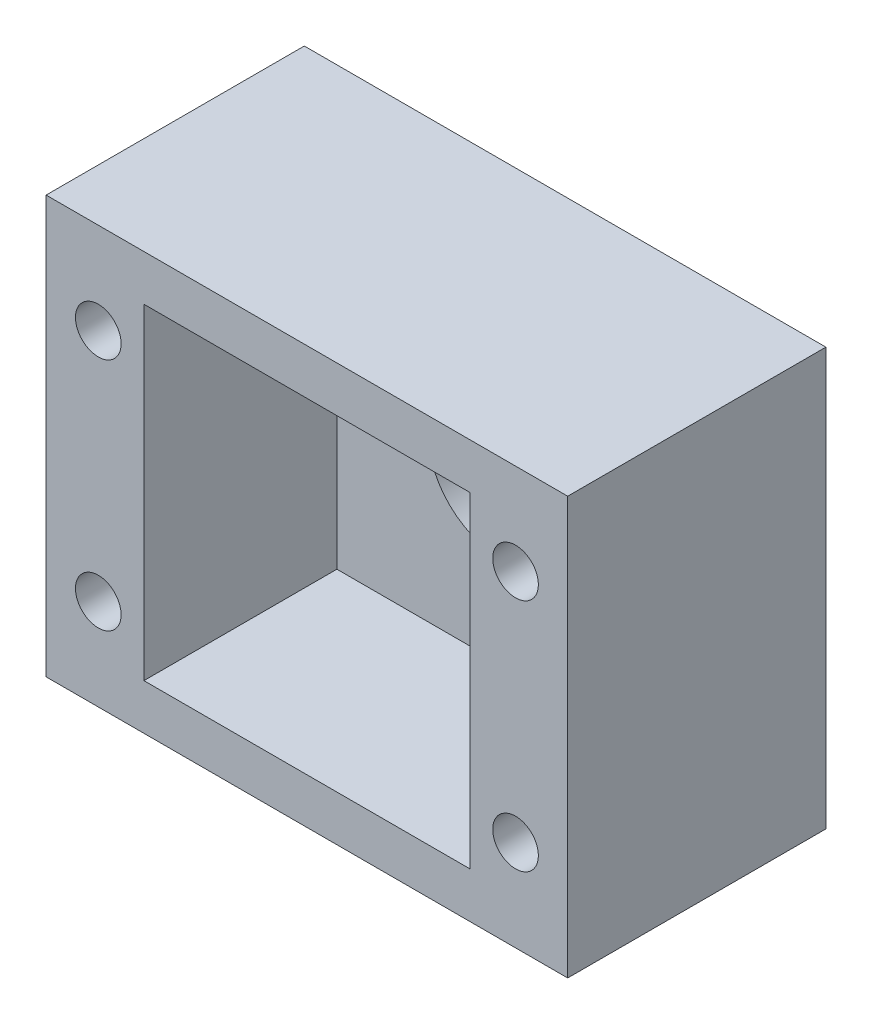
ISO-10303-21;
HEADER;
FILE_DESCRIPTION(('STEP AP214'),'2;1');
FILE_NAME('part.step','',(''),(''),'','','');
FILE_SCHEMA(('AUTOMOTIVE_DESIGN { 1 0 10303 214 1 1 1 1 }'));
ENDSEC;
DATA;
#1=APPLICATION_CONTEXT('core data for automotive mechanical design processes');
#2=APPLICATION_PROTOCOL_DEFINITION('international standard','automotive_design',2000,#1);
#3=PRODUCT_CONTEXT('',#1,'mechanical');
#4=PRODUCT('Part','Part','',(#3));
#5=PRODUCT_RELATED_PRODUCT_CATEGORY('part','',(#4));
#6=PRODUCT_DEFINITION_FORMATION('','',#4);
#7=PRODUCT_DEFINITION_CONTEXT('part definition',#1,'design');
#8=PRODUCT_DEFINITION('design','',#6,#7);
#9=PRODUCT_DEFINITION_SHAPE('','',#8);
#10=(LENGTH_UNIT() NAMED_UNIT(*) SI_UNIT(.MILLI.,.METRE.));
#11=(NAMED_UNIT(*) PLANE_ANGLE_UNIT() SI_UNIT($,.RADIAN.));
#12=(NAMED_UNIT(*) SI_UNIT($,.STERADIAN.) SOLID_ANGLE_UNIT());
#13=UNCERTAINTY_MEASURE_WITH_UNIT(LENGTH_MEASURE(1.E-05),#10,'distance_accuracy_value','');
#14=(GEOMETRIC_REPRESENTATION_CONTEXT(3) GLOBAL_UNCERTAINTY_ASSIGNED_CONTEXT((#13)) GLOBAL_UNIT_ASSIGNED_CONTEXT((#10,
#11,#12)) REPRESENTATION_CONTEXT('',''));
#15=CARTESIAN_POINT('',(0.,0.,0.));
#16=DIRECTION('',(0.,0.,1.));
#17=DIRECTION('',(1.,0.,0.));
#18=AXIS2_PLACEMENT_3D('',#15,#16,#17);
#19=CARTESIAN_POINT('',(-12.5,-12.5,5.));
#20=DIRECTION('',(0.,0.,1.));
#21=DIRECTION('',(1.,0.,0.));
#22=AXIS2_PLACEMENT_3D('',#19,#20,#21);
#23=PLANE('',#22);
#24=CARTESIAN_POINT('',(8.,0.,5.));
#25=DIRECTION('',(0.,0.,1.));
#26=DIRECTION('',(1.,0.,0.));
#27=AXIS2_PLACEMENT_3D('',#24,#25,#26);
#28=CIRCLE('',#27,1.25);
#29=CARTESIAN_POINT('',(9.25,0.,5.));
#30=VERTEX_POINT('',#29);
#31=EDGE_CURVE('E10',#30,#30,#28,.T.);
#32=ORIENTED_EDGE('',*,*,#31,.F.);
#33=EDGE_LOOP('',(#32));
#34=FACE_BOUND('',#33,.T.);
#35=CARTESIAN_POINT('',(0.,0.,5.));
#36=DIRECTION('',(0.,0.,1.));
#37=DIRECTION('',(1.,0.,0.));
#38=AXIS2_PLACEMENT_3D('',#35,#36,#37);
#39=CIRCLE('',#38,5.5);
#40=CARTESIAN_POINT('',(5.5,0.,5.));
#41=VERTEX_POINT('',#40);
#42=EDGE_CURVE('E24',#41,#41,#39,.T.);
#43=ORIENTED_EDGE('',*,*,#42,.F.);
#44=EDGE_LOOP('',(#43));
#45=FACE_BOUND('',#44,.T.);
#46=CARTESIAN_POINT('',(-8.,0.,5.));
#47=DIRECTION('',(0.,0.,1.));
#48=DIRECTION('',(1.,0.,0.));
#49=AXIS2_PLACEMENT_3D('',#46,#47,#48);
#50=CIRCLE('',#49,1.25);
#51=CARTESIAN_POINT('',(-6.75,0.,5.));
#52=VERTEX_POINT('',#51);
#53=EDGE_CURVE('E123',#52,#52,#50,.T.);
#54=ORIENTED_EDGE('',*,*,#53,.F.);
#55=EDGE_LOOP('',(#54));
#56=FACE_BOUND('',#55,.T.);
#57=DIRECTION('',(0.,1.,0.));
#58=VECTOR('',#57,1.);
#59=CARTESIAN_POINT('',(-12.5,-12.5,5.));
#60=LINE('',#59,#58);
#61=CARTESIAN_POINT('',(-12.5,-12.5,5.));
#62=VERTEX_POINT('',#61);
#63=CARTESIAN_POINT('',(-12.5,12.5,5.));
#64=VERTEX_POINT('',#63);
#65=EDGE_CURVE('E86',#62,#64,#60,.T.);
#66=ORIENTED_EDGE('',*,*,#65,.F.);
#67=DIRECTION('',(1.,0.,0.));
#68=VECTOR('',#67,1.);
#69=CARTESIAN_POINT('',(-12.5,-12.5,5.));
#70=LINE('',#69,#68);
#71=CARTESIAN_POINT('',(12.5,-12.5,5.));
#72=VERTEX_POINT('',#71);
#73=EDGE_CURVE('E89',#62,#72,#70,.T.);
#74=ORIENTED_EDGE('',*,*,#73,.T.);
#75=DIRECTION('',(0.,1.,0.));
#76=VECTOR('',#75,1.);
#77=CARTESIAN_POINT('',(12.5,-12.5,5.));
#78=LINE('',#77,#76);
#79=CARTESIAN_POINT('',(12.5,12.5,5.));
#80=VERTEX_POINT('',#79);
#81=EDGE_CURVE('E77',#72,#80,#78,.T.);
#82=ORIENTED_EDGE('',*,*,#81,.T.);
#83=DIRECTION('',(1.,0.,0.));
#84=VECTOR('',#83,1.);
#85=CARTESIAN_POINT('',(-12.5,12.5,5.));
#86=LINE('',#85,#84);
#87=EDGE_CURVE('E36',#64,#80,#86,.T.);
#88=ORIENTED_EDGE('',*,*,#87,.F.);
#89=EDGE_LOOP('',(#66,#74,#82,#88));
#90=FACE_BOUND('',#89,.T.);
#91=ADVANCED_FACE('F16',(#34,#45,#56,#90),#23,.T.);
#92=CARTESIAN_POINT('',(8.,0.,-1.));
#93=DIRECTION('',(0.,0.,1.));
#94=DIRECTION('',(1.,0.,0.));
#95=AXIS2_PLACEMENT_3D('',#92,#93,#94);
#96=CYLINDRICAL_SURFACE('',#95,1.25);
#97=ORIENTED_EDGE('',*,*,#31,.T.);
#98=EDGE_LOOP('',(#97));
#99=FACE_BOUND('',#98,.T.);
#100=CARTESIAN_POINT('',(8.,0.,0.));
#101=DIRECTION('',(0.,0.,1.));
#102=DIRECTION('',(1.,0.,0.));
#103=AXIS2_PLACEMENT_3D('',#100,#101,#102);
#104=CIRCLE('',#103,1.25);
#105=CARTESIAN_POINT('',(9.25,0.,0.));
#106=VERTEX_POINT('',#105);
#107=EDGE_CURVE('E108',#106,#106,#104,.T.);
#108=ORIENTED_EDGE('',*,*,#107,.F.);
#109=EDGE_LOOP('',(#108));
#110=FACE_BOUND('',#109,.T.);
#111=ADVANCED_FACE('F197',(#99,#110),#96,.F.);
#112=CARTESIAN_POINT('',(0.,0.,-1.));
#113=DIRECTION('',(0.,0.,1.));
#114=DIRECTION('',(1.,0.,0.));
#115=AXIS2_PLACEMENT_3D('',#112,#113,#114);
#116=CYLINDRICAL_SURFACE('',#115,5.5);
#117=ORIENTED_EDGE('',*,*,#42,.T.);
#118=EDGE_LOOP('',(#117));
#119=FACE_BOUND('',#118,.T.);
#120=CARTESIAN_POINT('',(0.,0.,0.));
#121=DIRECTION('',(0.,0.,1.));
#122=DIRECTION('',(1.,0.,0.));
#123=AXIS2_PLACEMENT_3D('',#120,#121,#122);
#124=CIRCLE('',#123,5.5);
#125=CARTESIAN_POINT('',(5.5,0.,0.));
#126=VERTEX_POINT('',#125);
#127=EDGE_CURVE('E135',#126,#126,#124,.T.);
#128=ORIENTED_EDGE('',*,*,#127,.F.);
#129=EDGE_LOOP('',(#128));
#130=FACE_BOUND('',#129,.T.);
#131=ADVANCED_FACE('F186',(#119,#130),#116,.F.);
#132=CARTESIAN_POINT('',(-8.,0.,-1.));
#133=DIRECTION('',(0.,0.,1.));
#134=DIRECTION('',(1.,0.,0.));
#135=AXIS2_PLACEMENT_3D('',#132,#133,#134);
#136=CYLINDRICAL_SURFACE('',#135,1.25);
#137=ORIENTED_EDGE('',*,*,#53,.T.);
#138=EDGE_LOOP('',(#137));
#139=FACE_BOUND('',#138,.T.);
#140=CARTESIAN_POINT('',(-8.,0.,0.));
#141=DIRECTION('',(0.,0.,1.));
#142=DIRECTION('',(1.,0.,0.));
#143=AXIS2_PLACEMENT_3D('',#140,#141,#142);
#144=CIRCLE('',#143,1.25);
#145=CARTESIAN_POINT('',(-6.75,0.,0.));
#146=VERTEX_POINT('',#145);
#147=EDGE_CURVE('E148',#146,#146,#144,.T.);
#148=ORIENTED_EDGE('',*,*,#147,.F.);
#149=EDGE_LOOP('',(#148));
#150=FACE_BOUND('',#149,.T.);
#151=ADVANCED_FACE('F183',(#139,#150),#136,.F.);
#152=CARTESIAN_POINT('',(16.,9.,-1.));
#153=DIRECTION('',(0.,0.,1.));
#154=DIRECTION('',(1.,0.,0.));
#155=AXIS2_PLACEMENT_3D('',#152,#153,#154);
#156=CYLINDRICAL_SURFACE('',#155,1.75);
#157=CARTESIAN_POINT('',(16.,9.,19.8));
#158=DIRECTION('',(0.,0.,1.));
#159=DIRECTION('',(1.,0.,0.));
#160=AXIS2_PLACEMENT_3D('',#157,#158,#159);
#161=CIRCLE('',#160,1.75);
#162=CARTESIAN_POINT('',(17.75,9.,19.8));
#163=VERTEX_POINT('',#162);
#164=EDGE_CURVE('E155',#163,#163,#161,.T.);
#165=ORIENTED_EDGE('',*,*,#164,.T.);
#166=EDGE_LOOP('',(#165));
#167=FACE_BOUND('',#166,.T.);
#168=CARTESIAN_POINT('',(16.,9.,0.));
#169=DIRECTION('',(0.,0.,1.));
#170=DIRECTION('',(1.,0.,0.));
#171=AXIS2_PLACEMENT_3D('',#168,#169,#170);
#172=CIRCLE('',#171,1.75);
#173=CARTESIAN_POINT('',(17.75,9.,0.));
#174=VERTEX_POINT('',#173);
#175=EDGE_CURVE('E102',#174,#174,#172,.T.);
#176=ORIENTED_EDGE('',*,*,#175,.F.);
#177=EDGE_LOOP('',(#176));
#178=FACE_BOUND('',#177,.T.);
#179=ADVANCED_FACE('F185',(#167,#178),#156,.F.);
#180=CARTESIAN_POINT('',(-12.5,12.5,5.));
#181=DIRECTION('',(0.,1.,0.));
#182=DIRECTION('',(1.,0.,0.));
#183=AXIS2_PLACEMENT_3D('',#180,#181,#182);
#184=PLANE('',#183);
#185=DIRECTION('',(-1.,0.,0.));
#186=VECTOR('',#185,1.);
#187=CARTESIAN_POINT('',(-16.25,12.5,19.8));
#188=LINE('',#187,#186);
#189=CARTESIAN_POINT('',(12.5,12.5,19.8));
#190=VERTEX_POINT('',#189);
#191=CARTESIAN_POINT('',(-12.5,12.5,19.8));
#192=VERTEX_POINT('',#191);
#193=EDGE_CURVE('E156',#190,#192,#188,.T.);
#194=ORIENTED_EDGE('',*,*,#193,.T.);
#195=DIRECTION('',(0.,0.,1.));
#196=VECTOR('',#195,1.);
#197=CARTESIAN_POINT('',(-12.5,12.5,5.));
#198=LINE('',#197,#196);
#199=EDGE_CURVE('E116',#64,#192,#198,.T.);
#200=ORIENTED_EDGE('',*,*,#199,.F.);
#201=ORIENTED_EDGE('',*,*,#87,.T.);
#202=DIRECTION('',(0.,0.,1.));
#203=VECTOR('',#202,1.);
#204=CARTESIAN_POINT('',(12.5,12.5,5.));
#205=LINE('',#204,#203);
#206=EDGE_CURVE('E84',#80,#190,#205,.T.);
#207=ORIENTED_EDGE('',*,*,#206,.T.);
#208=EDGE_LOOP('',(#194,#200,#201,#207));
#209=FACE_BOUND('',#208,.T.);
#210=ADVANCED_FACE('F194',(#209),#184,.F.);
#211=CARTESIAN_POINT('',(-12.5,-12.5,5.));
#212=DIRECTION('',(1.,0.,0.));
#213=DIRECTION('',(0.,1.,0.));
#214=AXIS2_PLACEMENT_3D('',#211,#212,#213);
#215=PLANE('',#214);
#216=DIRECTION('',(0.,0.,1.));
#217=VECTOR('',#216,1.);
#218=CARTESIAN_POINT('',(-12.5,-12.5,5.));
#219=LINE('',#218,#217);
#220=CARTESIAN_POINT('',(-12.5,-12.5,19.8));
#221=VERTEX_POINT('',#220);
#222=EDGE_CURVE('E95',#62,#221,#219,.T.);
#223=ORIENTED_EDGE('',*,*,#222,.F.);
#224=ORIENTED_EDGE('',*,*,#65,.T.);
#225=ORIENTED_EDGE('',*,*,#199,.T.);
#226=DIRECTION('',(0.,1.,0.));
#227=VECTOR('',#226,1.);
#228=CARTESIAN_POINT('',(-12.5,-14.25,19.8));
#229=LINE('',#228,#227);
#230=EDGE_CURVE('E151',#221,#192,#229,.T.);
#231=ORIENTED_EDGE('',*,*,#230,.F.);
#232=EDGE_LOOP('',(#223,#224,#225,#231));
#233=FACE_BOUND('',#232,.T.);
#234=ADVANCED_FACE('F433',(#233),#215,.T.);
#235=CARTESIAN_POINT('',(12.5,-12.5,5.));
#236=DIRECTION('',(1.,0.,0.));
#237=DIRECTION('',(0.,1.,0.));
#238=AXIS2_PLACEMENT_3D('',#235,#236,#237);
#239=PLANE('',#238);
#240=DIRECTION('',(0.,1.,0.));
#241=VECTOR('',#240,1.);
#242=CARTESIAN_POINT('',(12.5,-14.25,19.8));
#243=LINE('',#242,#241);
#244=CARTESIAN_POINT('',(12.5,-12.5,19.8));
#245=VERTEX_POINT('',#244);
#246=EDGE_CURVE('E153',#245,#190,#243,.T.);
#247=ORIENTED_EDGE('',*,*,#246,.T.);
#248=ORIENTED_EDGE('',*,*,#206,.F.);
#249=ORIENTED_EDGE('',*,*,#81,.F.);
#250=DIRECTION('',(0.,0.,1.));
#251=VECTOR('',#250,1.);
#252=CARTESIAN_POINT('',(12.5,-12.5,5.));
#253=LINE('',#252,#251);
#254=EDGE_CURVE('E82',#72,#245,#253,.T.);
#255=ORIENTED_EDGE('',*,*,#254,.T.);
#256=EDGE_LOOP('',(#247,#248,#249,#255));
#257=FACE_BOUND('',#256,.T.);
#258=ADVANCED_FACE('F80',(#257),#239,.F.);
#259=CARTESIAN_POINT('',(-12.5,-12.5,5.));
#260=DIRECTION('',(0.,1.,0.));
#261=DIRECTION('',(1.,0.,0.));
#262=AXIS2_PLACEMENT_3D('',#259,#260,#261);
#263=PLANE('',#262);
#264=ORIENTED_EDGE('',*,*,#254,.F.);
#265=ORIENTED_EDGE('',*,*,#73,.F.);
#266=ORIENTED_EDGE('',*,*,#222,.T.);
#267=DIRECTION('',(-1.,0.,0.));
#268=VECTOR('',#267,1.);
#269=CARTESIAN_POINT('',(-16.25,-12.5,19.8));
#270=LINE('',#269,#268);
#271=EDGE_CURVE('E100',#245,#221,#270,.T.);
#272=ORIENTED_EDGE('',*,*,#271,.F.);
#273=EDGE_LOOP('',(#264,#265,#266,#272));
#274=FACE_BOUND('',#273,.T.);
#275=ADVANCED_FACE('F98',(#274),#263,.T.);
#276=CARTESIAN_POINT('',(-16.,9.,-1.));
#277=DIRECTION('',(0.,0.,1.));
#278=DIRECTION('',(1.,0.,0.));
#279=AXIS2_PLACEMENT_3D('',#276,#277,#278);
#280=CYLINDRICAL_SURFACE('',#279,1.75);
#281=CARTESIAN_POINT('',(-16.,9.,19.8));
#282=DIRECTION('',(0.,0.,1.));
#283=DIRECTION('',(1.,0.,0.));
#284=AXIS2_PLACEMENT_3D('',#281,#282,#283);
#285=CIRCLE('',#284,1.75);
#286=CARTESIAN_POINT('',(-14.25,9.,19.8));
#287=VERTEX_POINT('',#286);
#288=EDGE_CURVE('E226',#287,#287,#285,.T.);
#289=ORIENTED_EDGE('',*,*,#288,.T.);
#290=EDGE_LOOP('',(#289));
#291=FACE_BOUND('',#290,.T.);
#292=CARTESIAN_POINT('',(-16.,9.,0.));
#293=DIRECTION('',(0.,0.,1.));
#294=DIRECTION('',(1.,0.,0.));
#295=AXIS2_PLACEMENT_3D('',#292,#293,#294);
#296=CIRCLE('',#295,1.75);
#297=CARTESIAN_POINT('',(-14.25,9.,0.));
#298=VERTEX_POINT('',#297);
#299=EDGE_CURVE('E132',#298,#298,#296,.T.);
#300=ORIENTED_EDGE('',*,*,#299,.F.);
#301=EDGE_LOOP('',(#300));
#302=FACE_BOUND('',#301,.T.);
#303=ADVANCED_FACE('F351',(#291,#302),#280,.F.);
#304=CARTESIAN_POINT('',(16.,-9.,-1.));
#305=DIRECTION('',(0.,0.,1.));
#306=DIRECTION('',(1.,0.,0.));
#307=AXIS2_PLACEMENT_3D('',#304,#305,#306);
#308=CYLINDRICAL_SURFACE('',#307,1.75);
#309=CARTESIAN_POINT('',(16.,-9.,19.8));
#310=DIRECTION('',(0.,0.,1.));
#311=DIRECTION('',(1.,0.,0.));
#312=AXIS2_PLACEMENT_3D('',#309,#310,#311);
#313=CIRCLE('',#312,1.75);
#314=CARTESIAN_POINT('',(17.75,-9.,19.8));
#315=VERTEX_POINT('',#314);
#316=EDGE_CURVE('E229',#315,#315,#313,.T.);
#317=ORIENTED_EDGE('',*,*,#316,.T.);
#318=EDGE_LOOP('',(#317));
#319=FACE_BOUND('',#318,.T.);
#320=CARTESIAN_POINT('',(16.,-9.,0.));
#321=DIRECTION('',(0.,0.,1.));
#322=DIRECTION('',(1.,0.,0.));
#323=AXIS2_PLACEMENT_3D('',#320,#321,#322);
#324=CIRCLE('',#323,1.75);
#325=CARTESIAN_POINT('',(17.75,-9.,0.));
#326=VERTEX_POINT('',#325);
#327=EDGE_CURVE('E172',#326,#326,#324,.T.);
#328=ORIENTED_EDGE('',*,*,#327,.F.);
#329=EDGE_LOOP('',(#328));
#330=FACE_BOUND('',#329,.T.);
#331=ADVANCED_FACE('F332',(#319,#330),#308,.F.);
#332=CARTESIAN_POINT('',(-16.,-9.,-1.));
#333=DIRECTION('',(0.,0.,1.));
#334=DIRECTION('',(1.,0.,0.));
#335=AXIS2_PLACEMENT_3D('',#332,#333,#334);
#336=CYLINDRICAL_SURFACE('',#335,1.75);
#337=CARTESIAN_POINT('',(-16.,-9.,19.8));
#338=DIRECTION('',(0.,0.,1.));
#339=DIRECTION('',(1.,0.,0.));
#340=AXIS2_PLACEMENT_3D('',#337,#338,#339);
#341=CIRCLE('',#340,1.75);
#342=CARTESIAN_POINT('',(-14.25,-9.,19.8));
#343=VERTEX_POINT('',#342);
#344=EDGE_CURVE('E225',#343,#343,#341,.T.);
#345=ORIENTED_EDGE('',*,*,#344,.T.);
#346=EDGE_LOOP('',(#345));
#347=FACE_BOUND('',#346,.T.);
#348=CARTESIAN_POINT('',(-16.,-9.,0.));
#349=DIRECTION('',(0.,0.,1.));
#350=DIRECTION('',(1.,0.,0.));
#351=AXIS2_PLACEMENT_3D('',#348,#349,#350);
#352=CIRCLE('',#351,1.75);
#353=CARTESIAN_POINT('',(-14.25,-9.,0.));
#354=VERTEX_POINT('',#353);
#355=EDGE_CURVE('E168',#354,#354,#352,.T.);
#356=ORIENTED_EDGE('',*,*,#355,.F.);
#357=EDGE_LOOP('',(#356));
#358=FACE_BOUND('',#357,.T.);
#359=ADVANCED_FACE('F329',(#347,#358),#336,.F.);
#360=CARTESIAN_POINT('',(20.,-16.,0.));
#361=DIRECTION('',(1.,0.,0.));
#362=DIRECTION('',(0.,1.,0.));
#363=AXIS2_PLACEMENT_3D('',#360,#361,#362);
#364=PLANE('',#363);
#365=DIRECTION('',(0.,0.,1.));
#366=VECTOR('',#365,1.);
#367=CARTESIAN_POINT('',(20.,-16.,0.));
#368=LINE('',#367,#366);
#369=CARTESIAN_POINT('',(20.,-16.,0.));
#370=VERTEX_POINT('',#369);
#371=CARTESIAN_POINT('',(20.,-16.,19.8));
#372=VERTEX_POINT('',#371);
#373=EDGE_CURVE('E243',#370,#372,#368,.T.);
#374=ORIENTED_EDGE('',*,*,#373,.F.);
#375=DIRECTION('',(0.,1.,0.));
#376=VECTOR('',#375,1.);
#377=CARTESIAN_POINT('',(20.,-16.,0.));
#378=LINE('',#377,#376);
#379=CARTESIAN_POINT('',(20.,16.,0.));
#380=VERTEX_POINT('',#379);
#381=EDGE_CURVE('E167',#370,#380,#378,.T.);
#382=ORIENTED_EDGE('',*,*,#381,.T.);
#383=DIRECTION('',(0.,0.,1.));
#384=VECTOR('',#383,1.);
#385=CARTESIAN_POINT('',(20.,16.,0.));
#386=LINE('',#385,#384);
#387=CARTESIAN_POINT('',(20.,16.,19.8));
#388=VERTEX_POINT('',#387);
#389=EDGE_CURVE('E164',#380,#388,#386,.T.);
#390=ORIENTED_EDGE('',*,*,#389,.T.);
#391=DIRECTION('',(0.,1.,0.));
#392=VECTOR('',#391,1.);
#393=CARTESIAN_POINT('',(20.,-16.,19.8));
#394=LINE('',#393,#392);
#395=EDGE_CURVE('E221',#372,#388,#394,.T.);
#396=ORIENTED_EDGE('',*,*,#395,.F.);
#397=EDGE_LOOP('',(#374,#382,#390,#396));
#398=FACE_BOUND('',#397,.T.);
#399=ADVANCED_FACE('F272',(#398),#364,.T.);
#400=CARTESIAN_POINT('',(-20.,-16.,0.));
#401=DIRECTION('',(0.,0.,1.));
#402=DIRECTION('',(1.,0.,0.));
#403=AXIS2_PLACEMENT_3D('',#400,#401,#402);
#404=PLANE('',#403);
#405=ORIENTED_EDGE('',*,*,#175,.T.);
#406=EDGE_LOOP('',(#405));
#407=FACE_BOUND('',#406,.T.);
#408=ORIENTED_EDGE('',*,*,#107,.T.);
#409=EDGE_LOOP('',(#408));
#410=FACE_BOUND('',#409,.T.);
#411=ORIENTED_EDGE('',*,*,#127,.T.);
#412=EDGE_LOOP('',(#411));
#413=FACE_BOUND('',#412,.T.);
#414=ORIENTED_EDGE('',*,*,#299,.T.);
#415=EDGE_LOOP('',(#414));
#416=FACE_BOUND('',#415,.T.);
#417=ORIENTED_EDGE('',*,*,#147,.T.);
#418=EDGE_LOOP('',(#417));
#419=FACE_BOUND('',#418,.T.);
#420=ORIENTED_EDGE('',*,*,#327,.T.);
#421=EDGE_LOOP('',(#420));
#422=FACE_BOUND('',#421,.T.);
#423=ORIENTED_EDGE('',*,*,#355,.T.);
#424=EDGE_LOOP('',(#423));
#425=FACE_BOUND('',#424,.T.);
#426=DIRECTION('',(1.,0.,0.));
#427=VECTOR('',#426,1.);
#428=CARTESIAN_POINT('',(-20.,16.,0.));
#429=LINE('',#428,#427);
#430=CARTESIAN_POINT('',(-20.,16.,0.));
#431=VERTEX_POINT('',#430);
#432=EDGE_CURVE('E160',#431,#380,#429,.T.);
#433=ORIENTED_EDGE('',*,*,#432,.T.);
#434=ORIENTED_EDGE('',*,*,#381,.F.);
#435=DIRECTION('',(1.,0.,0.));
#436=VECTOR('',#435,1.);
#437=CARTESIAN_POINT('',(-20.,-16.,0.));
#438=LINE('',#437,#436);
#439=CARTESIAN_POINT('',(-20.,-16.,0.));
#440=VERTEX_POINT('',#439);
#441=EDGE_CURVE('E253',#440,#370,#438,.T.);
#442=ORIENTED_EDGE('',*,*,#441,.F.);
#443=DIRECTION('',(0.,1.,0.));
#444=VECTOR('',#443,1.);
#445=CARTESIAN_POINT('',(-20.,-16.,0.));
#446=LINE('',#445,#444);
#447=EDGE_CURVE('E289',#440,#431,#446,.T.);
#448=ORIENTED_EDGE('',*,*,#447,.T.);
#449=EDGE_LOOP('',(#433,#434,#442,#448));
#450=FACE_BOUND('',#449,.T.);
#451=ADVANCED_FACE('F180',(#407,#410,#413,#416,#419,#422,#425,#450),#404,.F.);
#452=CARTESIAN_POINT('',(-20.,16.,0.));
#453=DIRECTION('',(0.,1.,0.));
#454=DIRECTION('',(1.,0.,0.));
#455=AXIS2_PLACEMENT_3D('',#452,#453,#454);
#456=PLANE('',#455);
#457=ORIENTED_EDGE('',*,*,#432,.F.);
#458=DIRECTION('',(0.,0.,1.));
#459=VECTOR('',#458,1.);
#460=CARTESIAN_POINT('',(-20.,16.,0.));
#461=LINE('',#460,#459);
#462=CARTESIAN_POINT('',(-20.,16.,19.8));
#463=VERTEX_POINT('',#462);
#464=EDGE_CURVE('E279',#431,#463,#461,.T.);
#465=ORIENTED_EDGE('',*,*,#464,.T.);
#466=DIRECTION('',(1.,0.,0.));
#467=VECTOR('',#466,1.);
#468=CARTESIAN_POINT('',(-20.,16.,19.8));
#469=LINE('',#468,#467);
#470=EDGE_CURVE('E222',#463,#388,#469,.T.);
#471=ORIENTED_EDGE('',*,*,#470,.T.);
#472=ORIENTED_EDGE('',*,*,#389,.F.);
#473=EDGE_LOOP('',(#457,#465,#471,#472));
#474=FACE_BOUND('',#473,.T.);
#475=ADVANCED_FACE('F277',(#474),#456,.T.);
#476=CARTESIAN_POINT('',(-20.,-16.,19.8));
#477=DIRECTION('',(0.,0.,1.));
#478=DIRECTION('',(1.,0.,0.));
#479=AXIS2_PLACEMENT_3D('',#476,#477,#478);
#480=PLANE('',#479);
#481=ORIENTED_EDGE('',*,*,#164,.F.);
#482=EDGE_LOOP('',(#481));
#483=FACE_BOUND('',#482,.T.);
#484=ORIENTED_EDGE('',*,*,#271,.T.);
#485=ORIENTED_EDGE('',*,*,#230,.T.);
#486=ORIENTED_EDGE('',*,*,#193,.F.);
#487=ORIENTED_EDGE('',*,*,#246,.F.);
#488=EDGE_LOOP('',(#484,#485,#486,#487));
#489=FACE_BOUND('',#488,.T.);
#490=ORIENTED_EDGE('',*,*,#288,.F.);
#491=EDGE_LOOP('',(#490));
#492=FACE_BOUND('',#491,.T.);
#493=ORIENTED_EDGE('',*,*,#316,.F.);
#494=EDGE_LOOP('',(#493));
#495=FACE_BOUND('',#494,.T.);
#496=ORIENTED_EDGE('',*,*,#344,.F.);
#497=EDGE_LOOP('',(#496));
#498=FACE_BOUND('',#497,.T.);
#499=DIRECTION('',(0.,1.,0.));
#500=VECTOR('',#499,1.);
#501=CARTESIAN_POINT('',(-20.,-16.,19.8));
#502=LINE('',#501,#500);
#503=CARTESIAN_POINT('',(-20.,-16.,19.8));
#504=VERTEX_POINT('',#503);
#505=EDGE_CURVE('E290',#504,#463,#502,.T.);
#506=ORIENTED_EDGE('',*,*,#505,.F.);
#507=DIRECTION('',(1.,0.,0.));
#508=VECTOR('',#507,1.);
#509=CARTESIAN_POINT('',(-20.,-16.,19.8));
#510=LINE('',#509,#508);
#511=EDGE_CURVE('E249',#504,#372,#510,.T.);
#512=ORIENTED_EDGE('',*,*,#511,.T.);
#513=ORIENTED_EDGE('',*,*,#395,.T.);
#514=ORIENTED_EDGE('',*,*,#470,.F.);
#515=EDGE_LOOP('',(#506,#512,#513,#514));
#516=FACE_BOUND('',#515,.T.);
#517=ADVANCED_FACE('F267',(#483,#489,#492,#495,#498,#516),#480,.T.);
#518=CARTESIAN_POINT('',(-20.,-16.,0.));
#519=DIRECTION('',(0.,1.,0.));
#520=DIRECTION('',(1.,0.,0.));
#521=AXIS2_PLACEMENT_3D('',#518,#519,#520);
#522=PLANE('',#521);
#523=ORIENTED_EDGE('',*,*,#373,.T.);
#524=ORIENTED_EDGE('',*,*,#511,.F.);
#525=DIRECTION('',(0.,0.,1.));
#526=VECTOR('',#525,1.);
#527=CARTESIAN_POINT('',(-20.,-16.,0.));
#528=LINE('',#527,#526);
#529=EDGE_CURVE('E294',#440,#504,#528,.T.);
#530=ORIENTED_EDGE('',*,*,#529,.F.);
#531=ORIENTED_EDGE('',*,*,#441,.T.);
#532=EDGE_LOOP('',(#523,#524,#530,#531));
#533=FACE_BOUND('',#532,.T.);
#534=ADVANCED_FACE('F306',(#533),#522,.F.);
#535=CARTESIAN_POINT('',(-20.,-16.,0.));
#536=DIRECTION('',(1.,0.,0.));
#537=DIRECTION('',(0.,1.,0.));
#538=AXIS2_PLACEMENT_3D('',#535,#536,#537);
#539=PLANE('',#538);
#540=ORIENTED_EDGE('',*,*,#505,.T.);
#541=ORIENTED_EDGE('',*,*,#464,.F.);
#542=ORIENTED_EDGE('',*,*,#447,.F.);
#543=ORIENTED_EDGE('',*,*,#529,.T.);
#544=EDGE_LOOP('',(#540,#541,#542,#543));
#545=FACE_BOUND('',#544,.T.);
#546=ADVANCED_FACE('F293',(#545),#539,.F.);
#547=CLOSED_SHELL('',(#91,#111,#131,#151,#179,#210,#234,#258,#275,#303,#331,#359,#399,#451,#475,
#517,#534,#546));
#548=MANIFOLD_SOLID_BREP('B1',#547);
#549=ADVANCED_BREP_SHAPE_REPRESENTATION('',(#18,#548),#14);
#550=SHAPE_DEFINITION_REPRESENTATION(#9,#549);
ENDSEC;
END-ISO-10303-21;
